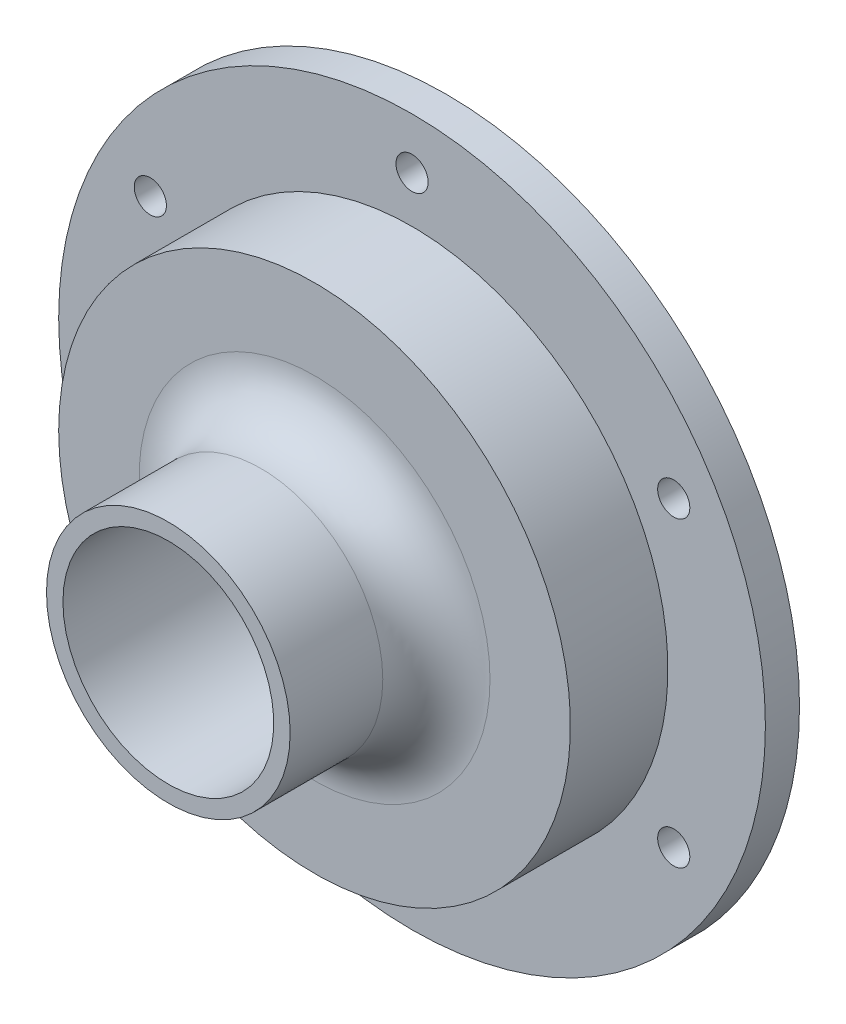
ISO-10303-21;
HEADER;
FILE_DESCRIPTION(('STEP AP214'),'2;1');
FILE_NAME('part.step','',(''),(''),'','','');
FILE_SCHEMA(('AUTOMOTIVE_DESIGN { 1 0 10303 214 1 1 1 1 }'));
ENDSEC;
DATA;
#1=APPLICATION_CONTEXT('core data for automotive mechanical design processes');
#2=APPLICATION_PROTOCOL_DEFINITION('international standard','automotive_design',2000,#1);
#3=PRODUCT_CONTEXT('',#1,'mechanical');
#4=PRODUCT('Part','Part','',(#3));
#5=PRODUCT_RELATED_PRODUCT_CATEGORY('part','',(#4));
#6=PRODUCT_DEFINITION_FORMATION('','',#4);
#7=PRODUCT_DEFINITION_CONTEXT('part definition',#1,'design');
#8=PRODUCT_DEFINITION('design','',#6,#7);
#9=PRODUCT_DEFINITION_SHAPE('','',#8);
#10=(LENGTH_UNIT() NAMED_UNIT(*) SI_UNIT(.MILLI.,.METRE.));
#11=(NAMED_UNIT(*) PLANE_ANGLE_UNIT() SI_UNIT($,.RADIAN.));
#12=(NAMED_UNIT(*) SI_UNIT($,.STERADIAN.) SOLID_ANGLE_UNIT());
#13=UNCERTAINTY_MEASURE_WITH_UNIT(LENGTH_MEASURE(1.E-05),#10,'distance_accuracy_value','');
#14=(GEOMETRIC_REPRESENTATION_CONTEXT(3) GLOBAL_UNCERTAINTY_ASSIGNED_CONTEXT((#13)) GLOBAL_UNIT_ASSIGNED_CONTEXT((#10,
#11,#12)) REPRESENTATION_CONTEXT('',''));
#15=CARTESIAN_POINT('',(0.,0.,0.));
#16=DIRECTION('',(0.,0.,1.));
#17=DIRECTION('',(1.,0.,0.));
#18=AXIS2_PLACEMENT_3D('',#15,#16,#17);
#19=CARTESIAN_POINT('',(-21.625,0.,0.));
#20=DIRECTION('',(0.,0.,-1.));
#21=DIRECTION('',(-1.,0.,0.));
#22=AXIS2_PLACEMENT_3D('',#19,#20,#21);
#23=PLANE('',#22);
#24=CARTESIAN_POINT('',(-53.6935750346348,31.0000000000006,0.));
#25=DIRECTION('',(0.,0.,-1.));
#26=DIRECTION('',(-1.,0.,0.));
#27=AXIS2_PLACEMENT_3D('',#24,#25,#26);
#28=CIRCLE('',#27,7.27349999999999);
#29=CARTESIAN_POINT('',(-60.9670750346348,31.0000000000006,0.));
#30=VERTEX_POINT('',#29);
#31=EDGE_CURVE('E248',#30,#30,#28,.T.);
#32=ORIENTED_EDGE('',*,*,#31,.F.);
#33=EDGE_LOOP('',(#32));
#34=FACE_BOUND('',#33,.T.);
#35=CARTESIAN_POINT('',(-53.6935750346355,-30.9999999999995,0.));
#36=DIRECTION('',(0.,0.,-1.));
#37=DIRECTION('',(-1.,0.,0.));
#38=AXIS2_PLACEMENT_3D('',#35,#36,#37);
#39=CIRCLE('',#38,7.27349999999999);
#40=CARTESIAN_POINT('',(-60.9670750346355,-30.9999999999995,0.));
#41=VERTEX_POINT('',#40);
#42=EDGE_CURVE('E88',#41,#41,#39,.T.);
#43=ORIENTED_EDGE('',*,*,#42,.F.);
#44=EDGE_LOOP('',(#43));
#45=FACE_BOUND('',#44,.T.);
#46=CARTESIAN_POINT('',(0.,-62.,0.));
#47=DIRECTION('',(0.,0.,-1.));
#48=DIRECTION('',(-1.,0.,0.));
#49=AXIS2_PLACEMENT_3D('',#46,#47,#48);
#50=CIRCLE('',#49,7.27349999999999);
#51=CARTESIAN_POINT('',(-7.27349999999999,-62.,0.));
#52=VERTEX_POINT('',#51);
#53=EDGE_CURVE('E75',#52,#52,#50,.T.);
#54=ORIENTED_EDGE('',*,*,#53,.F.);
#55=EDGE_LOOP('',(#54));
#56=FACE_BOUND('',#55,.T.);
#57=CARTESIAN_POINT('',(53.6935750346351,-31.0000000000003,0.));
#58=DIRECTION('',(0.,0.,-1.));
#59=DIRECTION('',(-1.,0.,0.));
#60=AXIS2_PLACEMENT_3D('',#57,#58,#59);
#61=CIRCLE('',#60,7.27349999999999);
#62=CARTESIAN_POINT('',(46.4200750346351,-31.0000000000003,0.));
#63=VERTEX_POINT('',#62);
#64=EDGE_CURVE('E71',#63,#63,#61,.T.);
#65=ORIENTED_EDGE('',*,*,#64,.F.);
#66=EDGE_LOOP('',(#65));
#67=FACE_BOUND('',#66,.T.);
#68=CARTESIAN_POINT('',(53.6935750346353,30.9999999999999,0.));
#69=DIRECTION('',(0.,0.,-1.));
#70=DIRECTION('',(-1.,0.,0.));
#71=AXIS2_PLACEMENT_3D('',#68,#69,#70);
#72=CIRCLE('',#71,7.27349999999999);
#73=CARTESIAN_POINT('',(46.4200750346353,30.9999999999999,0.));
#74=VERTEX_POINT('',#73);
#75=EDGE_CURVE('E67',#74,#74,#72,.T.);
#76=ORIENTED_EDGE('',*,*,#75,.F.);
#77=EDGE_LOOP('',(#76));
#78=FACE_BOUND('',#77,.T.);
#79=CARTESIAN_POINT('',(0.,62.,0.));
#80=DIRECTION('',(0.,0.,-1.));
#81=DIRECTION('',(-1.,0.,0.));
#82=AXIS2_PLACEMENT_3D('',#79,#80,#81);
#83=CIRCLE('',#82,7.27349999999999);
#84=CARTESIAN_POINT('',(-7.27349999999999,62.,0.));
#85=VERTEX_POINT('',#84);
#86=EDGE_CURVE('E62',#85,#85,#83,.T.);
#87=ORIENTED_EDGE('',*,*,#86,.F.);
#88=EDGE_LOOP('',(#87));
#89=FACE_BOUND('',#88,.T.);
#90=CARTESIAN_POINT('',(0.,0.,0.));
#91=DIRECTION('',(0.,0.,-1.));
#92=DIRECTION('',(-1.,0.,0.));
#93=AXIS2_PLACEMENT_3D('',#90,#91,#92);
#94=CIRCLE('',#93,72.5);
#95=CARTESIAN_POINT('',(-72.5,0.,0.));
#96=VERTEX_POINT('',#95);
#97=EDGE_CURVE('E50',#96,#96,#94,.T.);
#98=ORIENTED_EDGE('',*,*,#97,.T.);
#99=EDGE_LOOP('',(#98));
#100=FACE_BOUND('',#99,.T.);
#101=CARTESIAN_POINT('',(0.,0.,0.));
#102=DIRECTION('',(0.,0.,-1.));
#103=DIRECTION('',(-1.,0.,0.));
#104=AXIS2_PLACEMENT_3D('',#101,#102,#103);
#105=CIRCLE('',#104,21.625);
#106=CARTESIAN_POINT('',(-21.625,0.,0.));
#107=VERTEX_POINT('',#106);
#108=EDGE_CURVE('E57',#107,#107,#105,.T.);
#109=ORIENTED_EDGE('',*,*,#108,.F.);
#110=EDGE_LOOP('',(#109));
#111=FACE_BOUND('',#110,.T.);
#112=ADVANCED_FACE('F37',(#34,#45,#56,#67,#78,#89,#100,#111),#23,.T.);
#113=CARTESIAN_POINT('',(0.,0.,0.));
#114=DIRECTION('',(0.,0.,-1.));
#115=DIRECTION('',(-1.,0.,0.));
#116=AXIS2_PLACEMENT_3D('',#113,#114,#115);
#117=CYLINDRICAL_SURFACE('',#116,72.5);
#118=CARTESIAN_POINT('',(0.,0.,7.));
#119=DIRECTION('',(0.,0.,-1.));
#120=DIRECTION('',(-1.,0.,0.));
#121=AXIS2_PLACEMENT_3D('',#118,#119,#120);
#122=CIRCLE('',#121,72.5);
#123=CARTESIAN_POINT('',(-72.5,0.,7.));
#124=VERTEX_POINT('',#123);
#125=EDGE_CURVE('E131',#124,#124,#122,.T.);
#126=ORIENTED_EDGE('',*,*,#125,.T.);
#127=EDGE_LOOP('',(#126));
#128=FACE_BOUND('',#127,.T.);
#129=ORIENTED_EDGE('',*,*,#97,.F.);
#130=EDGE_LOOP('',(#129));
#131=FACE_BOUND('',#130,.T.);
#132=ADVANCED_FACE('F138',(#128,#131),#117,.T.);
#133=CARTESIAN_POINT('',(-72.5,0.,7.));
#134=DIRECTION('',(0.,0.,1.));
#135=DIRECTION('',(1.,0.,0.));
#136=AXIS2_PLACEMENT_3D('',#133,#134,#135);
#137=PLANE('',#136);
#138=CARTESIAN_POINT('',(-53.6935750346348,31.0000000000006,7.));
#139=DIRECTION('',(0.,0.,1.));
#140=DIRECTION('',(1.,0.,0.));
#141=AXIS2_PLACEMENT_3D('',#138,#139,#140);
#142=CIRCLE('',#141,3.29999999999999);
#143=CARTESIAN_POINT('',(-50.3935750346348,31.0000000000006,7.));
#144=VERTEX_POINT('',#143);
#145=EDGE_CURVE('E41',#144,#144,#142,.T.);
#146=ORIENTED_EDGE('',*,*,#145,.F.);
#147=EDGE_LOOP('',(#146));
#148=FACE_BOUND('',#147,.T.);
#149=CARTESIAN_POINT('',(-53.6935750346355,-30.9999999999995,7.));
#150=DIRECTION('',(0.,0.,1.));
#151=DIRECTION('',(1.,0.,0.));
#152=AXIS2_PLACEMENT_3D('',#149,#150,#151);
#153=CIRCLE('',#152,3.29999999999999);
#154=CARTESIAN_POINT('',(-50.3935750346355,-30.9999999999995,7.));
#155=VERTEX_POINT('',#154);
#156=EDGE_CURVE('E73',#155,#155,#153,.T.);
#157=ORIENTED_EDGE('',*,*,#156,.F.);
#158=EDGE_LOOP('',(#157));
#159=FACE_BOUND('',#158,.T.);
#160=CARTESIAN_POINT('',(0.,-62.,7.));
#161=DIRECTION('',(0.,0.,1.));
#162=DIRECTION('',(1.,0.,0.));
#163=AXIS2_PLACEMENT_3D('',#160,#161,#162);
#164=CIRCLE('',#163,3.29999999999999);
#165=CARTESIAN_POINT('',(3.29999999999999,-62.,7.));
#166=VERTEX_POINT('',#165);
#167=EDGE_CURVE('E69',#166,#166,#164,.T.);
#168=ORIENTED_EDGE('',*,*,#167,.F.);
#169=EDGE_LOOP('',(#168));
#170=FACE_BOUND('',#169,.T.);
#171=CARTESIAN_POINT('',(53.6935750346351,-31.0000000000003,7.));
#172=DIRECTION('',(0.,0.,1.));
#173=DIRECTION('',(1.,0.,0.));
#174=AXIS2_PLACEMENT_3D('',#171,#172,#173);
#175=CIRCLE('',#174,3.29999999999999);
#176=CARTESIAN_POINT('',(56.9935750346351,-31.0000000000003,7.));
#177=VERTEX_POINT('',#176);
#178=EDGE_CURVE('E64',#177,#177,#175,.T.);
#179=ORIENTED_EDGE('',*,*,#178,.F.);
#180=EDGE_LOOP('',(#179));
#181=FACE_BOUND('',#180,.T.);
#182=CARTESIAN_POINT('',(53.6935750346353,30.9999999999999,7.));
#183=DIRECTION('',(0.,0.,1.));
#184=DIRECTION('',(1.,0.,0.));
#185=AXIS2_PLACEMENT_3D('',#182,#183,#184);
#186=CIRCLE('',#185,3.29999999999999);
#187=CARTESIAN_POINT('',(56.9935750346353,30.9999999999999,7.));
#188=VERTEX_POINT('',#187);
#189=EDGE_CURVE('E59',#188,#188,#186,.T.);
#190=ORIENTED_EDGE('',*,*,#189,.F.);
#191=EDGE_LOOP('',(#190));
#192=FACE_BOUND('',#191,.T.);
#193=CARTESIAN_POINT('',(0.,62.,7.));
#194=DIRECTION('',(0.,0.,1.));
#195=DIRECTION('',(1.,0.,0.));
#196=AXIS2_PLACEMENT_3D('',#193,#194,#195);
#197=CIRCLE('',#196,3.29999999999999);
#198=CARTESIAN_POINT('',(3.29999999999999,62.,7.));
#199=VERTEX_POINT('',#198);
#200=EDGE_CURVE('E54',#199,#199,#197,.T.);
#201=ORIENTED_EDGE('',*,*,#200,.F.);
#202=EDGE_LOOP('',(#201));
#203=FACE_BOUND('',#202,.T.);
#204=CARTESIAN_POINT('',(0.,0.,7.));
#205=DIRECTION('',(0.,0.,-1.));
#206=DIRECTION('',(-1.,0.,0.));
#207=AXIS2_PLACEMENT_3D('',#204,#205,#206);
#208=CIRCLE('',#207,52.5);
#209=CARTESIAN_POINT('',(-52.5,0.,7.));
#210=VERTEX_POINT('',#209);
#211=EDGE_CURVE('E128',#210,#210,#208,.T.);
#212=ORIENTED_EDGE('',*,*,#211,.T.);
#213=EDGE_LOOP('',(#212));
#214=FACE_BOUND('',#213,.T.);
#215=ORIENTED_EDGE('',*,*,#125,.F.);
#216=EDGE_LOOP('',(#215));
#217=FACE_BOUND('',#216,.T.);
#218=ADVANCED_FACE('F140',(#148,#159,#170,#181,#192,#203,#214,#217),#137,.T.);
#219=CARTESIAN_POINT('',(0.,0.,0.));
#220=DIRECTION('',(0.,0.,-1.));
#221=DIRECTION('',(-1.,0.,0.));
#222=AXIS2_PLACEMENT_3D('',#219,#220,#221);
#223=CYLINDRICAL_SURFACE('',#222,52.5);
#224=CARTESIAN_POINT('',(0.,0.,27.));
#225=DIRECTION('',(0.,0.,-1.));
#226=DIRECTION('',(-1.,0.,0.));
#227=AXIS2_PLACEMENT_3D('',#224,#225,#226);
#228=CIRCLE('',#227,52.5);
#229=CARTESIAN_POINT('',(-52.5,0.,27.));
#230=VERTEX_POINT('',#229);
#231=EDGE_CURVE('E125',#230,#230,#228,.T.);
#232=ORIENTED_EDGE('',*,*,#231,.T.);
#233=EDGE_LOOP('',(#232));
#234=FACE_BOUND('',#233,.T.);
#235=ORIENTED_EDGE('',*,*,#211,.F.);
#236=EDGE_LOOP('',(#235));
#237=FACE_BOUND('',#236,.T.);
#238=ADVANCED_FACE('F147',(#234,#237),#223,.T.);
#239=CARTESIAN_POINT('',(-52.5,0.,27.));
#240=DIRECTION('',(0.,0.,1.));
#241=DIRECTION('',(1.,0.,0.));
#242=AXIS2_PLACEMENT_3D('',#239,#240,#241);
#243=PLANE('',#242);
#244=CARTESIAN_POINT('',(0.,0.,27.));
#245=DIRECTION('',(0.,0.,1.));
#246=DIRECTION('',(1.,0.,0.));
#247=AXIS2_PLACEMENT_3D('',#244,#245,#246);
#248=CIRCLE('',#247,36.);
#249=CARTESIAN_POINT('',(36.,0.,27.));
#250=VERTEX_POINT('',#249);
#251=EDGE_CURVE('E45',#250,#250,#248,.F.);
#252=ORIENTED_EDGE('',*,*,#251,.T.);
#253=EDGE_LOOP('',(#252));
#254=FACE_BOUND('',#253,.T.);
#255=ORIENTED_EDGE('',*,*,#231,.F.);
#256=EDGE_LOOP('',(#255));
#257=FACE_BOUND('',#256,.T.);
#258=ADVANCED_FACE('F154',(#254,#257),#243,.T.);
#259=CARTESIAN_POINT('',(0.,0.,0.));
#260=DIRECTION('',(0.,0.,-1.));
#261=DIRECTION('',(-1.,0.,0.));
#262=AXIS2_PLACEMENT_3D('',#259,#260,#261);
#263=CYLINDRICAL_SURFACE('',#262,25.);
#264=CARTESIAN_POINT('',(0.,0.,38.));
#265=DIRECTION('',(0.,0.,1.));
#266=DIRECTION('',(1.,0.,0.));
#267=AXIS2_PLACEMENT_3D('',#264,#265,#266);
#268=CIRCLE('',#267,25.);
#269=CARTESIAN_POINT('',(25.,0.,38.));
#270=VERTEX_POINT('',#269);
#271=EDGE_CURVE('E10',#270,#270,#268,.T.);
#272=ORIENTED_EDGE('',*,*,#271,.T.);
#273=EDGE_LOOP('',(#272));
#274=FACE_BOUND('',#273,.T.);
#275=CARTESIAN_POINT('',(0.,0.,57.));
#276=DIRECTION('',(0.,0.,-1.));
#277=DIRECTION('',(-1.,0.,0.));
#278=AXIS2_PLACEMENT_3D('',#275,#276,#277);
#279=CIRCLE('',#278,25.);
#280=CARTESIAN_POINT('',(-25.,0.,57.));
#281=VERTEX_POINT('',#280);
#282=EDGE_CURVE('E122',#281,#281,#279,.T.);
#283=ORIENTED_EDGE('',*,*,#282,.T.);
#284=EDGE_LOOP('',(#283));
#285=FACE_BOUND('',#284,.T.);
#286=ADVANCED_FACE('F158',(#274,#285),#263,.T.);
#287=CARTESIAN_POINT('',(-25.,0.,57.));
#288=DIRECTION('',(0.,0.,1.));
#289=DIRECTION('',(1.,0.,0.));
#290=AXIS2_PLACEMENT_3D('',#287,#288,#289);
#291=PLANE('',#290);
#292=CARTESIAN_POINT('',(0.,0.,57.));
#293=DIRECTION('',(0.,0.,-1.));
#294=DIRECTION('',(-1.,0.,0.));
#295=AXIS2_PLACEMENT_3D('',#292,#293,#294);
#296=CIRCLE('',#295,21.625);
#297=CARTESIAN_POINT('',(-21.625,0.,57.));
#298=VERTEX_POINT('',#297);
#299=EDGE_CURVE('E119',#298,#298,#296,.T.);
#300=ORIENTED_EDGE('',*,*,#299,.T.);
#301=EDGE_LOOP('',(#300));
#302=FACE_BOUND('',#301,.T.);
#303=ORIENTED_EDGE('',*,*,#282,.F.);
#304=EDGE_LOOP('',(#303));
#305=FACE_BOUND('',#304,.T.);
#306=ADVANCED_FACE('F162',(#302,#305),#291,.T.);
#307=CARTESIAN_POINT('',(0.,0.,0.));
#308=DIRECTION('',(0.,0.,-1.));
#309=DIRECTION('',(-1.,0.,0.));
#310=AXIS2_PLACEMENT_3D('',#307,#308,#309);
#311=CYLINDRICAL_SURFACE('',#310,21.625);
#312=ORIENTED_EDGE('',*,*,#108,.T.);
#313=EDGE_LOOP('',(#312));
#314=FACE_BOUND('',#313,.T.);
#315=ORIENTED_EDGE('',*,*,#299,.F.);
#316=EDGE_LOOP('',(#315));
#317=FACE_BOUND('',#316,.T.);
#318=ADVANCED_FACE('F165',(#314,#317),#311,.F.);
#319=CARTESIAN_POINT('',(0.,0.,38.));
#320=DIRECTION('',(0.,0.,1.));
#321=DIRECTION('',(1.,0.,0.));
#322=AXIS2_PLACEMENT_3D('',#319,#320,#321);
#323=TOROIDAL_SURFACE('',#322,36.,11.);
#324=ORIENTED_EDGE('',*,*,#271,.F.);
#325=EDGE_LOOP('',(#324));
#326=FACE_BOUND('',#325,.T.);
#327=ORIENTED_EDGE('',*,*,#251,.F.);
#328=EDGE_LOOP('',(#327));
#329=FACE_BOUND('',#328,.T.);
#330=ADVANCED_FACE('F39',(#326,#329),#323,.F.);
#331=CARTESIAN_POINT('',(0.,62.,0.));
#332=DIRECTION('',(0.,0.,-1.));
#333=DIRECTION('',(-1.,0.,0.));
#334=AXIS2_PLACEMENT_3D('',#331,#332,#333);
#335=CYLINDRICAL_SURFACE('',#334,3.29999999999999);
#336=ORIENTED_EDGE('',*,*,#200,.T.);
#337=EDGE_LOOP('',(#336));
#338=FACE_BOUND('',#337,.T.);
#339=CARTESIAN_POINT('',(0.,62.,1.));
#340=DIRECTION('',(0.,0.,-1.));
#341=DIRECTION('',(-1.,0.,0.));
#342=AXIS2_PLACEMENT_3D('',#339,#340,#341);
#343=CIRCLE('',#342,3.3);
#344=CARTESIAN_POINT('',(-3.3,62.,1.));
#345=VERTEX_POINT('',#344);
#346=EDGE_CURVE('E58',#345,#345,#343,.T.);
#347=ORIENTED_EDGE('',*,*,#346,.T.);
#348=EDGE_LOOP('',(#347));
#349=FACE_BOUND('',#348,.T.);
#350=ADVANCED_FACE('F170',(#338,#349),#335,.F.);
#351=CARTESIAN_POINT('',(3.3,62.,1.));
#352=DIRECTION('',(0.,0.,1.));
#353=DIRECTION('',(1.,0.,0.));
#354=AXIS2_PLACEMENT_3D('',#351,#352,#353);
#355=PLANE('',#354);
#356=ORIENTED_EDGE('',*,*,#346,.F.);
#357=EDGE_LOOP('',(#356));
#358=FACE_BOUND('',#357,.T.);
#359=CARTESIAN_POINT('',(0.,62.,1.));
#360=DIRECTION('',(0.,0.,-1.));
#361=DIRECTION('',(-1.,0.,0.));
#362=AXIS2_PLACEMENT_3D('',#359,#360,#361);
#363=CIRCLE('',#362,7.2735);
#364=CARTESIAN_POINT('',(-7.2735,62.,1.));
#365=VERTEX_POINT('',#364);
#366=EDGE_CURVE('E112',#365,#365,#363,.T.);
#367=ORIENTED_EDGE('',*,*,#366,.T.);
#368=EDGE_LOOP('',(#367));
#369=FACE_BOUND('',#368,.T.);
#370=ADVANCED_FACE('F173',(#358,#369),#355,.F.);
#371=CARTESIAN_POINT('',(0.,62.,0.));
#372=DIRECTION('',(0.,0.,-1.));
#373=DIRECTION('',(-1.,0.,0.));
#374=AXIS2_PLACEMENT_3D('',#371,#372,#373);
#375=CYLINDRICAL_SURFACE('',#374,7.2735);
#376=ORIENTED_EDGE('',*,*,#366,.F.);
#377=EDGE_LOOP('',(#376));
#378=FACE_BOUND('',#377,.T.);
#379=ORIENTED_EDGE('',*,*,#86,.T.);
#380=EDGE_LOOP('',(#379));
#381=FACE_BOUND('',#380,.T.);
#382=ADVANCED_FACE('F177',(#378,#381),#375,.F.);
#383=CARTESIAN_POINT('',(53.6935750346353,30.9999999999999,0.));
#384=DIRECTION('',(0.,0.,-1.));
#385=DIRECTION('',(-1.,0.,0.));
#386=AXIS2_PLACEMENT_3D('',#383,#384,#385);
#387=CYLINDRICAL_SURFACE('',#386,3.29999999999999);
#388=ORIENTED_EDGE('',*,*,#189,.T.);
#389=EDGE_LOOP('',(#388));
#390=FACE_BOUND('',#389,.T.);
#391=CARTESIAN_POINT('',(53.6935750346353,30.9999999999999,1.));
#392=DIRECTION('',(0.,0.,-1.));
#393=DIRECTION('',(-1.,0.,0.));
#394=AXIS2_PLACEMENT_3D('',#391,#392,#393);
#395=CIRCLE('',#394,3.3);
#396=CARTESIAN_POINT('',(50.3935750346353,30.9999999999999,1.));
#397=VERTEX_POINT('',#396);
#398=EDGE_CURVE('E63',#397,#397,#395,.T.);
#399=ORIENTED_EDGE('',*,*,#398,.T.);
#400=EDGE_LOOP('',(#399));
#401=FACE_BOUND('',#400,.T.);
#402=ADVANCED_FACE('F181',(#390,#401),#387,.F.);
#403=CARTESIAN_POINT('',(56.9935750346353,30.9999999999999,1.));
#404=DIRECTION('',(0.,0.,1.));
#405=DIRECTION('',(1.,0.,0.));
#406=AXIS2_PLACEMENT_3D('',#403,#404,#405);
#407=PLANE('',#406);
#408=ORIENTED_EDGE('',*,*,#398,.F.);
#409=EDGE_LOOP('',(#408));
#410=FACE_BOUND('',#409,.T.);
#411=CARTESIAN_POINT('',(53.6935750346353,30.9999999999999,1.));
#412=DIRECTION('',(0.,0.,-1.));
#413=DIRECTION('',(-1.,0.,0.));
#414=AXIS2_PLACEMENT_3D('',#411,#412,#413);
#415=CIRCLE('',#414,7.27349999999999);
#416=CARTESIAN_POINT('',(46.4200750346353,30.9999999999999,1.));
#417=VERTEX_POINT('',#416);
#418=EDGE_CURVE('E105',#417,#417,#415,.T.);
#419=ORIENTED_EDGE('',*,*,#418,.T.);
#420=EDGE_LOOP('',(#419));
#421=FACE_BOUND('',#420,.T.);
#422=ADVANCED_FACE('F185',(#410,#421),#407,.F.);
#423=CARTESIAN_POINT('',(53.6935750346353,30.9999999999999,0.));
#424=DIRECTION('',(0.,0.,-1.));
#425=DIRECTION('',(-1.,0.,0.));
#426=AXIS2_PLACEMENT_3D('',#423,#424,#425);
#427=CYLINDRICAL_SURFACE('',#426,7.27349999999999);
#428=ORIENTED_EDGE('',*,*,#418,.F.);
#429=EDGE_LOOP('',(#428));
#430=FACE_BOUND('',#429,.T.);
#431=ORIENTED_EDGE('',*,*,#75,.T.);
#432=EDGE_LOOP('',(#431));
#433=FACE_BOUND('',#432,.T.);
#434=ADVANCED_FACE('F189',(#430,#433),#427,.F.);
#435=CARTESIAN_POINT('',(53.6935750346351,-31.0000000000003,0.));
#436=DIRECTION('',(0.,0.,-1.));
#437=DIRECTION('',(-1.,0.,0.));
#438=AXIS2_PLACEMENT_3D('',#435,#436,#437);
#439=CYLINDRICAL_SURFACE('',#438,3.29999999999999);
#440=ORIENTED_EDGE('',*,*,#178,.T.);
#441=EDGE_LOOP('',(#440));
#442=FACE_BOUND('',#441,.T.);
#443=CARTESIAN_POINT('',(53.6935750346351,-31.0000000000003,1.));
#444=DIRECTION('',(0.,0.,-1.));
#445=DIRECTION('',(-1.,0.,0.));
#446=AXIS2_PLACEMENT_3D('',#443,#444,#445);
#447=CIRCLE('',#446,3.3);
#448=CARTESIAN_POINT('',(50.3935750346351,-31.0000000000003,1.));
#449=VERTEX_POINT('',#448);
#450=EDGE_CURVE('E68',#449,#449,#447,.T.);
#451=ORIENTED_EDGE('',*,*,#450,.T.);
#452=EDGE_LOOP('',(#451));
#453=FACE_BOUND('',#452,.T.);
#454=ADVANCED_FACE('F193',(#442,#453),#439,.F.);
#455=CARTESIAN_POINT('',(56.9935750346351,-31.0000000000003,1.));
#456=DIRECTION('',(0.,0.,1.));
#457=DIRECTION('',(1.,0.,0.));
#458=AXIS2_PLACEMENT_3D('',#455,#456,#457);
#459=PLANE('',#458);
#460=ORIENTED_EDGE('',*,*,#450,.F.);
#461=EDGE_LOOP('',(#460));
#462=FACE_BOUND('',#461,.T.);
#463=CARTESIAN_POINT('',(53.6935750346351,-31.0000000000003,1.));
#464=DIRECTION('',(0.,0.,-1.));
#465=DIRECTION('',(-1.,0.,0.));
#466=AXIS2_PLACEMENT_3D('',#463,#464,#465);
#467=CIRCLE('',#466,7.27349999999999);
#468=CARTESIAN_POINT('',(46.4200750346351,-31.0000000000003,1.));
#469=VERTEX_POINT('',#468);
#470=EDGE_CURVE('E98',#469,#469,#467,.T.);
#471=ORIENTED_EDGE('',*,*,#470,.T.);
#472=EDGE_LOOP('',(#471));
#473=FACE_BOUND('',#472,.T.);
#474=ADVANCED_FACE('F197',(#462,#473),#459,.F.);
#475=CARTESIAN_POINT('',(53.6935750346351,-31.0000000000003,0.));
#476=DIRECTION('',(0.,0.,-1.));
#477=DIRECTION('',(-1.,0.,0.));
#478=AXIS2_PLACEMENT_3D('',#475,#476,#477);
#479=CYLINDRICAL_SURFACE('',#478,7.27349999999999);
#480=ORIENTED_EDGE('',*,*,#470,.F.);
#481=EDGE_LOOP('',(#480));
#482=FACE_BOUND('',#481,.T.);
#483=ORIENTED_EDGE('',*,*,#64,.T.);
#484=EDGE_LOOP('',(#483));
#485=FACE_BOUND('',#484,.T.);
#486=ADVANCED_FACE('F201',(#482,#485),#479,.F.);
#487=CARTESIAN_POINT('',(0.,-62.,0.));
#488=DIRECTION('',(0.,0.,-1.));
#489=DIRECTION('',(-1.,0.,0.));
#490=AXIS2_PLACEMENT_3D('',#487,#488,#489);
#491=CYLINDRICAL_SURFACE('',#490,3.29999999999999);
#492=ORIENTED_EDGE('',*,*,#167,.T.);
#493=EDGE_LOOP('',(#492));
#494=FACE_BOUND('',#493,.T.);
#495=CARTESIAN_POINT('',(0.,-62.,1.));
#496=DIRECTION('',(0.,0.,-1.));
#497=DIRECTION('',(-1.,0.,0.));
#498=AXIS2_PLACEMENT_3D('',#495,#496,#497);
#499=CIRCLE('',#498,3.3);
#500=CARTESIAN_POINT('',(-3.3,-62.,1.));
#501=VERTEX_POINT('',#500);
#502=EDGE_CURVE('E72',#501,#501,#499,.T.);
#503=ORIENTED_EDGE('',*,*,#502,.T.);
#504=EDGE_LOOP('',(#503));
#505=FACE_BOUND('',#504,.T.);
#506=ADVANCED_FACE('F205',(#494,#505),#491,.F.);
#507=CARTESIAN_POINT('',(3.3,-62.,1.));
#508=DIRECTION('',(0.,0.,1.));
#509=DIRECTION('',(1.,0.,0.));
#510=AXIS2_PLACEMENT_3D('',#507,#508,#509);
#511=PLANE('',#510);
#512=ORIENTED_EDGE('',*,*,#502,.F.);
#513=EDGE_LOOP('',(#512));
#514=FACE_BOUND('',#513,.T.);
#515=CARTESIAN_POINT('',(0.,-62.,1.));
#516=DIRECTION('',(0.,0.,-1.));
#517=DIRECTION('',(-1.,0.,0.));
#518=AXIS2_PLACEMENT_3D('',#515,#516,#517);
#519=CIRCLE('',#518,7.2735);
#520=CARTESIAN_POINT('',(-7.2735,-62.,1.));
#521=VERTEX_POINT('',#520);
#522=EDGE_CURVE('E80',#521,#521,#519,.T.);
#523=ORIENTED_EDGE('',*,*,#522,.T.);
#524=EDGE_LOOP('',(#523));
#525=FACE_BOUND('',#524,.T.);
#526=ADVANCED_FACE('F209',(#514,#525),#511,.F.);
#527=CARTESIAN_POINT('',(0.,-62.,0.));
#528=DIRECTION('',(0.,0.,-1.));
#529=DIRECTION('',(-1.,0.,0.));
#530=AXIS2_PLACEMENT_3D('',#527,#528,#529);
#531=CYLINDRICAL_SURFACE('',#530,7.2735);
#532=ORIENTED_EDGE('',*,*,#522,.F.);
#533=EDGE_LOOP('',(#532));
#534=FACE_BOUND('',#533,.T.);
#535=ORIENTED_EDGE('',*,*,#53,.T.);
#536=EDGE_LOOP('',(#535));
#537=FACE_BOUND('',#536,.T.);
#538=ADVANCED_FACE('F213',(#534,#537),#531,.F.);
#539=CARTESIAN_POINT('',(-53.6935750346355,-30.9999999999995,0.));
#540=DIRECTION('',(0.,0.,-1.));
#541=DIRECTION('',(-1.,0.,0.));
#542=AXIS2_PLACEMENT_3D('',#539,#540,#541);
#543=CYLINDRICAL_SURFACE('',#542,3.29999999999999);
#544=ORIENTED_EDGE('',*,*,#156,.T.);
#545=EDGE_LOOP('',(#544));
#546=FACE_BOUND('',#545,.T.);
#547=CARTESIAN_POINT('',(-53.6935750346355,-30.9999999999995,1.));
#548=DIRECTION('',(0.,0.,-1.));
#549=DIRECTION('',(-1.,0.,0.));
#550=AXIS2_PLACEMENT_3D('',#547,#548,#549);
#551=CIRCLE('',#550,3.3);
#552=CARTESIAN_POINT('',(-56.9935750346355,-30.9999999999995,1.));
#553=VERTEX_POINT('',#552);
#554=EDGE_CURVE('E76',#553,#553,#551,.T.);
#555=ORIENTED_EDGE('',*,*,#554,.T.);
#556=EDGE_LOOP('',(#555));
#557=FACE_BOUND('',#556,.T.);
#558=ADVANCED_FACE('F217',(#546,#557),#543,.F.);
#559=CARTESIAN_POINT('',(-50.3935750346355,-30.9999999999995,1.));
#560=DIRECTION('',(0.,0.,1.));
#561=DIRECTION('',(1.,0.,0.));
#562=AXIS2_PLACEMENT_3D('',#559,#560,#561);
#563=PLANE('',#562);
#564=ORIENTED_EDGE('',*,*,#554,.F.);
#565=EDGE_LOOP('',(#564));
#566=FACE_BOUND('',#565,.T.);
#567=CARTESIAN_POINT('',(-53.6935750346355,-30.9999999999995,1.));
#568=DIRECTION('',(0.,0.,-1.));
#569=DIRECTION('',(-1.,0.,0.));
#570=AXIS2_PLACEMENT_3D('',#567,#568,#569);
#571=CIRCLE('',#570,7.2735);
#572=CARTESIAN_POINT('',(-60.9670750346355,-30.9999999999995,1.));
#573=VERTEX_POINT('',#572);
#574=EDGE_CURVE('E83',#573,#573,#571,.T.);
#575=ORIENTED_EDGE('',*,*,#574,.T.);
#576=EDGE_LOOP('',(#575));
#577=FACE_BOUND('',#576,.T.);
#578=ADVANCED_FACE('F221',(#566,#577),#563,.F.);
#579=CARTESIAN_POINT('',(-53.6935750346355,-30.9999999999995,0.));
#580=DIRECTION('',(0.,0.,-1.));
#581=DIRECTION('',(-1.,0.,0.));
#582=AXIS2_PLACEMENT_3D('',#579,#580,#581);
#583=CYLINDRICAL_SURFACE('',#582,7.2735);
#584=ORIENTED_EDGE('',*,*,#574,.F.);
#585=EDGE_LOOP('',(#584));
#586=FACE_BOUND('',#585,.T.);
#587=ORIENTED_EDGE('',*,*,#42,.T.);
#588=EDGE_LOOP('',(#587));
#589=FACE_BOUND('',#588,.T.);
#590=ADVANCED_FACE('F224',(#586,#589),#583,.F.);
#591=CARTESIAN_POINT('',(-53.6935750346348,31.0000000000006,0.));
#592=DIRECTION('',(0.,0.,-1.));
#593=DIRECTION('',(-1.,0.,0.));
#594=AXIS2_PLACEMENT_3D('',#591,#592,#593);
#595=CYLINDRICAL_SURFACE('',#594,3.29999999999999);
#596=ORIENTED_EDGE('',*,*,#145,.T.);
#597=EDGE_LOOP('',(#596));
#598=FACE_BOUND('',#597,.T.);
#599=CARTESIAN_POINT('',(-53.6935750346348,31.0000000000006,1.));
#600=DIRECTION('',(0.,0.,-1.));
#601=DIRECTION('',(-1.,0.,0.));
#602=AXIS2_PLACEMENT_3D('',#599,#600,#601);
#603=CIRCLE('',#602,3.3);
#604=CARTESIAN_POINT('',(-56.9935750346348,31.0000000000006,1.));
#605=VERTEX_POINT('',#604);
#606=EDGE_CURVE('E250',#605,#605,#603,.T.);
#607=ORIENTED_EDGE('',*,*,#606,.T.);
#608=EDGE_LOOP('',(#607));
#609=FACE_BOUND('',#608,.T.);
#610=ADVANCED_FACE('F228',(#598,#609),#595,.F.);
#611=CARTESIAN_POINT('',(-50.3935750346348,31.0000000000006,1.));
#612=DIRECTION('',(0.,0.,1.));
#613=DIRECTION('',(1.,0.,0.));
#614=AXIS2_PLACEMENT_3D('',#611,#612,#613);
#615=PLANE('',#614);
#616=ORIENTED_EDGE('',*,*,#606,.F.);
#617=EDGE_LOOP('',(#616));
#618=FACE_BOUND('',#617,.T.);
#619=CARTESIAN_POINT('',(-53.6935750346348,31.0000000000006,1.));
#620=DIRECTION('',(0.,0.,-1.));
#621=DIRECTION('',(-1.,0.,0.));
#622=AXIS2_PLACEMENT_3D('',#619,#620,#621);
#623=CIRCLE('',#622,7.27349999999999);
#624=CARTESIAN_POINT('',(-60.9670750346348,31.0000000000006,1.));
#625=VERTEX_POINT('',#624);
#626=EDGE_CURVE('E245',#625,#625,#623,.T.);
#627=ORIENTED_EDGE('',*,*,#626,.T.);
#628=EDGE_LOOP('',(#627));
#629=FACE_BOUND('',#628,.T.);
#630=ADVANCED_FACE('F232',(#618,#629),#615,.F.);
#631=CARTESIAN_POINT('',(-53.6935750346348,31.0000000000006,0.));
#632=DIRECTION('',(0.,0.,-1.));
#633=DIRECTION('',(-1.,0.,0.));
#634=AXIS2_PLACEMENT_3D('',#631,#632,#633);
#635=CYLINDRICAL_SURFACE('',#634,7.27349999999999);
#636=ORIENTED_EDGE('',*,*,#626,.F.);
#637=EDGE_LOOP('',(#636));
#638=FACE_BOUND('',#637,.T.);
#639=ORIENTED_EDGE('',*,*,#31,.T.);
#640=EDGE_LOOP('',(#639));
#641=FACE_BOUND('',#640,.T.);
#642=ADVANCED_FACE('F236',(#638,#641),#635,.F.);
#643=CLOSED_SHELL('',(#112,#132,#218,#238,#258,#286,#306,#318,#330,#350,#370,#382,#402,#422,
#434,#454,#474,#486,#506,#526,#538,#558,#578,#590,#610,#630,#642));
#644=MANIFOLD_SOLID_BREP('B2',#643);
#645=ADVANCED_BREP_SHAPE_REPRESENTATION('',(#18,#644),#14);
#646=SHAPE_DEFINITION_REPRESENTATION(#9,#645);
ENDSEC;
END-ISO-10303-21;
